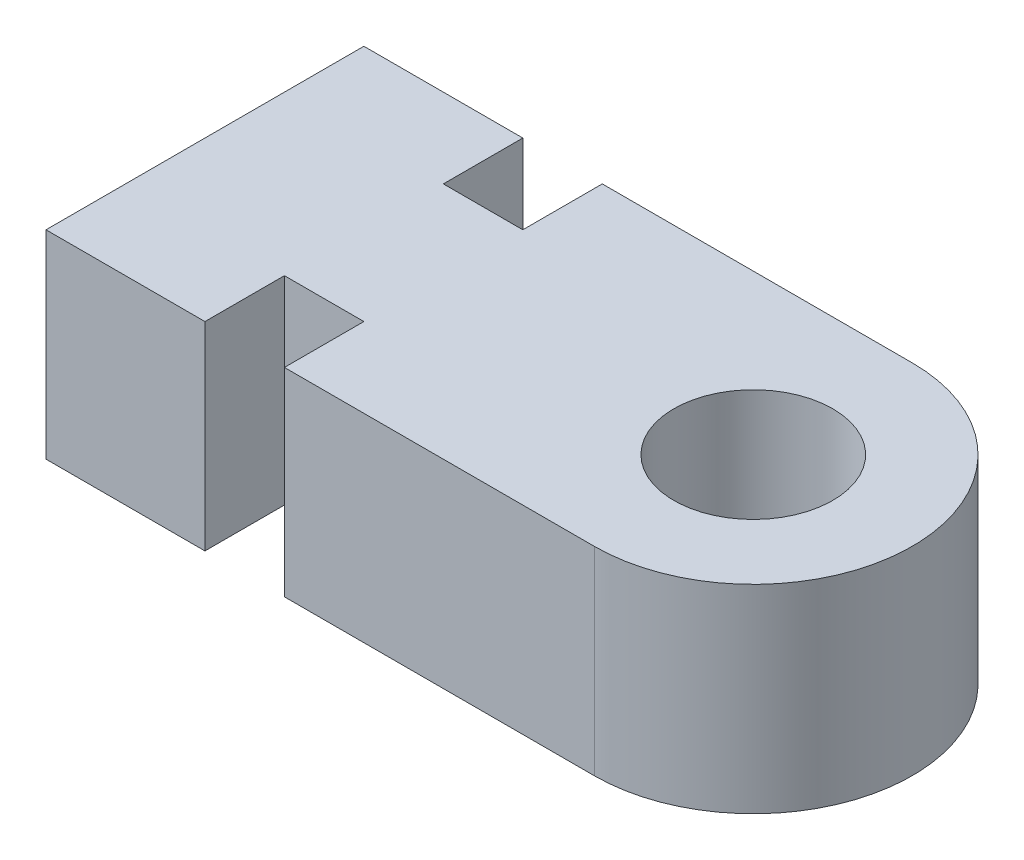
ISO-10303-21;
HEADER;
FILE_DESCRIPTION(('STEP AP214'),'2;1');
FILE_NAME('part.step','',(''),(''),'','','');
FILE_SCHEMA(('AUTOMOTIVE_DESIGN { 1 0 10303 214 1 1 1 1 }'));
ENDSEC;
DATA;
#1=APPLICATION_CONTEXT('core data for automotive mechanical design processes');
#2=APPLICATION_PROTOCOL_DEFINITION('international standard','automotive_design',2000,#1);
#3=PRODUCT_CONTEXT('',#1,'mechanical');
#4=PRODUCT('Part','Part','',(#3));
#5=PRODUCT_RELATED_PRODUCT_CATEGORY('part','',(#4));
#6=PRODUCT_DEFINITION_FORMATION('','',#4);
#7=PRODUCT_DEFINITION_CONTEXT('part definition',#1,'design');
#8=PRODUCT_DEFINITION('design','',#6,#7);
#9=PRODUCT_DEFINITION_SHAPE('','',#8);
#10=(LENGTH_UNIT() NAMED_UNIT(*) SI_UNIT(.MILLI.,.METRE.));
#11=(NAMED_UNIT(*) PLANE_ANGLE_UNIT() SI_UNIT($,.RADIAN.));
#12=(NAMED_UNIT(*) SI_UNIT($,.STERADIAN.) SOLID_ANGLE_UNIT());
#13=UNCERTAINTY_MEASURE_WITH_UNIT(LENGTH_MEASURE(1.E-05),#10,'distance_accuracy_value','');
#14=(GEOMETRIC_REPRESENTATION_CONTEXT(3) GLOBAL_UNCERTAINTY_ASSIGNED_CONTEXT((#13)) GLOBAL_UNIT_ASSIGNED_CONTEXT((#10,
#11,#12)) REPRESENTATION_CONTEXT('',''));
#15=CARTESIAN_POINT('',(0.,0.,0.));
#16=DIRECTION('',(0.,0.,1.));
#17=DIRECTION('',(1.,0.,0.));
#18=AXIS2_PLACEMENT_3D('',#15,#16,#17);
#19=CARTESIAN_POINT('',(1752.6,635.,0.));
#20=DIRECTION('',(0.,-1.,0.));
#21=DIRECTION('',(0.,0.,-1.));
#22=AXIS2_PLACEMENT_3D('',#19,#20,#21);
#23=PLANE('',#22);
#24=DIRECTION('',(1.,0.,0.));
#25=VECTOR('',#24,1.);
#26=CARTESIAN_POINT('',(0.,635.,508.));
#27=LINE('',#26,#25);
#28=CARTESIAN_POINT('',(0.,635.,508.));
#29=VERTEX_POINT('',#28);
#30=CARTESIAN_POINT('',(508.,635.,508.));
#31=VERTEX_POINT('',#30);
#32=EDGE_CURVE('E177',#29,#31,#27,.T.);
#33=ORIENTED_EDGE('',*,*,#32,.T.);
#34=DIRECTION('',(0.,0.,-1.));
#35=VECTOR('',#34,1.);
#36=CARTESIAN_POINT('',(508.,635.,508.));
#37=LINE('',#36,#35);
#38=CARTESIAN_POINT('',(508.,635.,254.));
#39=VERTEX_POINT('',#38);
#40=EDGE_CURVE('E105',#31,#39,#37,.T.);
#41=ORIENTED_EDGE('',*,*,#40,.T.);
#42=DIRECTION('',(1.,0.,0.));
#43=VECTOR('',#42,1.);
#44=CARTESIAN_POINT('',(508.,635.,254.));
#45=LINE('',#44,#43);
#46=CARTESIAN_POINT('',(762.,635.,254.));
#47=VERTEX_POINT('',#46);
#48=EDGE_CURVE('E204',#39,#47,#45,.T.);
#49=ORIENTED_EDGE('',*,*,#48,.T.);
#50=DIRECTION('',(0.,0.,1.));
#51=VECTOR('',#50,1.);
#52=CARTESIAN_POINT('',(762.,635.,254.));
#53=LINE('',#52,#51);
#54=CARTESIAN_POINT('',(762.,635.,508.));
#55=VERTEX_POINT('',#54);
#56=EDGE_CURVE('E223',#47,#55,#53,.T.);
#57=ORIENTED_EDGE('',*,*,#56,.T.);
#58=DIRECTION('',(1.,0.,0.));
#59=VECTOR('',#58,1.);
#60=CARTESIAN_POINT('',(762.,635.,508.));
#61=LINE('',#60,#59);
#62=CARTESIAN_POINT('',(1752.6,635.,508.));
#63=VERTEX_POINT('',#62);
#64=EDGE_CURVE('E220',#55,#63,#61,.T.);
#65=ORIENTED_EDGE('',*,*,#64,.T.);
#66=CARTESIAN_POINT('',(1752.6,635.,0.));
#67=DIRECTION('',(0.,1.,0.));
#68=DIRECTION('',(0.,0.,-1.));
#69=AXIS2_PLACEMENT_3D('',#66,#67,#68);
#70=CIRCLE('',#69,508.);
#71=CARTESIAN_POINT('',(1752.6,635.,-508.));
#72=VERTEX_POINT('',#71);
#73=EDGE_CURVE('E222',#63,#72,#70,.T.);
#74=ORIENTED_EDGE('',*,*,#73,.T.);
#75=DIRECTION('',(-1.,0.,0.));
#76=VECTOR('',#75,1.);
#77=CARTESIAN_POINT('',(762.,635.,-508.));
#78=LINE('',#77,#76);
#79=CARTESIAN_POINT('',(762.,635.,-508.));
#80=VERTEX_POINT('',#79);
#81=EDGE_CURVE('E225',#72,#80,#78,.T.);
#82=ORIENTED_EDGE('',*,*,#81,.T.);
#83=DIRECTION('',(0.,0.,1.));
#84=VECTOR('',#83,1.);
#85=CARTESIAN_POINT('',(762.,635.,-254.));
#86=LINE('',#85,#84);
#87=CARTESIAN_POINT('',(762.,635.,-254.));
#88=VERTEX_POINT('',#87);
#89=EDGE_CURVE('E231',#80,#88,#86,.T.);
#90=ORIENTED_EDGE('',*,*,#89,.T.);
#91=DIRECTION('',(-1.,0.,0.));
#92=VECTOR('',#91,1.);
#93=CARTESIAN_POINT('',(508.,635.,-254.));
#94=LINE('',#93,#92);
#95=CARTESIAN_POINT('',(508.,635.,-254.));
#96=VERTEX_POINT('',#95);
#97=EDGE_CURVE('E136',#88,#96,#94,.T.);
#98=ORIENTED_EDGE('',*,*,#97,.T.);
#99=DIRECTION('',(0.,0.,-1.));
#100=VECTOR('',#99,1.);
#101=CARTESIAN_POINT('',(508.,635.,-508.));
#102=LINE('',#101,#100);
#103=CARTESIAN_POINT('',(508.,635.,-508.));
#104=VERTEX_POINT('',#103);
#105=EDGE_CURVE('E130',#96,#104,#102,.T.);
#106=ORIENTED_EDGE('',*,*,#105,.T.);
#107=DIRECTION('',(-1.,0.,0.));
#108=VECTOR('',#107,1.);
#109=CARTESIAN_POINT('',(0.,635.,-508.));
#110=LINE('',#109,#108);
#111=CARTESIAN_POINT('',(0.,635.,-508.));
#112=VERTEX_POINT('',#111);
#113=EDGE_CURVE('E134',#104,#112,#110,.T.);
#114=ORIENTED_EDGE('',*,*,#113,.T.);
#115=DIRECTION('',(0.,0.,1.));
#116=VECTOR('',#115,1.);
#117=CARTESIAN_POINT('',(0.,635.,508.));
#118=LINE('',#117,#116);
#119=EDGE_CURVE('E50',#112,#29,#118,.T.);
#120=ORIENTED_EDGE('',*,*,#119,.T.);
#121=EDGE_LOOP('',(#33,#41,#49,#57,#65,#74,#82,#90,#98,#106,#114,#120));
#122=FACE_BOUND('',#121,.T.);
#123=CARTESIAN_POINT('',(1752.6,635.,0.));
#124=DIRECTION('',(0.,1.,0.));
#125=DIRECTION('',(0.,0.,1.));
#126=AXIS2_PLACEMENT_3D('',#123,#124,#125);
#127=CIRCLE('',#126,254.);
#128=CARTESIAN_POINT('',(1752.6,635.,-254.));
#129=VERTEX_POINT('',#128);
#130=EDGE_CURVE('E158',#129,#129,#127,.T.);
#131=ORIENTED_EDGE('',*,*,#130,.F.);
#132=EDGE_LOOP('',(#131));
#133=FACE_BOUND('',#132,.T.);
#134=ADVANCED_FACE('F33',(#122,#133),#23,.F.);
#135=CARTESIAN_POINT('',(1752.6,0.,0.));
#136=DIRECTION('',(0.,-1.,0.));
#137=DIRECTION('',(0.,0.,-1.));
#138=AXIS2_PLACEMENT_3D('',#135,#136,#137);
#139=PLANE('',#138);
#140=DIRECTION('',(1.,0.,0.));
#141=VECTOR('',#140,1.);
#142=CARTESIAN_POINT('',(0.,0.,508.));
#143=LINE('',#142,#141);
#144=CARTESIAN_POINT('',(0.,0.,508.));
#145=VERTEX_POINT('',#144);
#146=CARTESIAN_POINT('',(508.,0.,508.));
#147=VERTEX_POINT('',#146);
#148=EDGE_CURVE('E154',#145,#147,#143,.T.);
#149=ORIENTED_EDGE('',*,*,#148,.F.);
#150=DIRECTION('',(0.,0.,1.));
#151=VECTOR('',#150,1.);
#152=CARTESIAN_POINT('',(0.,0.,508.));
#153=LINE('',#152,#151);
#154=CARTESIAN_POINT('',(0.,0.,-508.));
#155=VERTEX_POINT('',#154);
#156=EDGE_CURVE('E97',#155,#145,#153,.T.);
#157=ORIENTED_EDGE('',*,*,#156,.F.);
#158=DIRECTION('',(-1.,0.,0.));
#159=VECTOR('',#158,1.);
#160=CARTESIAN_POINT('',(0.,0.,-508.));
#161=LINE('',#160,#159);
#162=CARTESIAN_POINT('',(508.,0.,-508.));
#163=VERTEX_POINT('',#162);
#164=EDGE_CURVE('E91',#163,#155,#161,.T.);
#165=ORIENTED_EDGE('',*,*,#164,.F.);
#166=DIRECTION('',(0.,0.,-1.));
#167=VECTOR('',#166,1.);
#168=CARTESIAN_POINT('',(508.,0.,-508.));
#169=LINE('',#168,#167);
#170=CARTESIAN_POINT('',(508.,0.,-254.));
#171=VERTEX_POINT('',#170);
#172=EDGE_CURVE('E144',#171,#163,#169,.T.);
#173=ORIENTED_EDGE('',*,*,#172,.F.);
#174=DIRECTION('',(-1.,0.,0.));
#175=VECTOR('',#174,1.);
#176=CARTESIAN_POINT('',(508.,0.,-254.));
#177=LINE('',#176,#175);
#178=CARTESIAN_POINT('',(762.,0.,-254.));
#179=VERTEX_POINT('',#178);
#180=EDGE_CURVE('E172',#179,#171,#177,.T.);
#181=ORIENTED_EDGE('',*,*,#180,.F.);
#182=DIRECTION('',(0.,0.,1.));
#183=VECTOR('',#182,1.);
#184=CARTESIAN_POINT('',(762.,0.,-254.));
#185=LINE('',#184,#183);
#186=CARTESIAN_POINT('',(762.,0.,-508.));
#187=VERTEX_POINT('',#186);
#188=EDGE_CURVE('E170',#187,#179,#185,.T.);
#189=ORIENTED_EDGE('',*,*,#188,.F.);
#190=DIRECTION('',(-1.,0.,0.));
#191=VECTOR('',#190,1.);
#192=CARTESIAN_POINT('',(762.,0.,-508.));
#193=LINE('',#192,#191);
#194=CARTESIAN_POINT('',(1752.6,0.,-508.));
#195=VERTEX_POINT('',#194);
#196=EDGE_CURVE('E168',#195,#187,#193,.T.);
#197=ORIENTED_EDGE('',*,*,#196,.F.);
#198=CARTESIAN_POINT('',(1752.6,0.,0.));
#199=DIRECTION('',(0.,1.,0.));
#200=DIRECTION('',(0.,0.,-1.));
#201=AXIS2_PLACEMENT_3D('',#198,#199,#200);
#202=CIRCLE('',#201,508.);
#203=CARTESIAN_POINT('',(1752.6,0.,508.));
#204=VERTEX_POINT('',#203);
#205=EDGE_CURVE('E166',#204,#195,#202,.T.);
#206=ORIENTED_EDGE('',*,*,#205,.F.);
#207=DIRECTION('',(1.,0.,0.));
#208=VECTOR('',#207,1.);
#209=CARTESIAN_POINT('',(762.,0.,508.));
#210=LINE('',#209,#208);
#211=CARTESIAN_POINT('',(762.,0.,508.));
#212=VERTEX_POINT('',#211);
#213=EDGE_CURVE('E164',#212,#204,#210,.T.);
#214=ORIENTED_EDGE('',*,*,#213,.F.);
#215=DIRECTION('',(0.,0.,1.));
#216=VECTOR('',#215,1.);
#217=CARTESIAN_POINT('',(762.,0.,254.));
#218=LINE('',#217,#216);
#219=CARTESIAN_POINT('',(762.,0.,254.));
#220=VERTEX_POINT('',#219);
#221=EDGE_CURVE('E162',#220,#212,#218,.T.);
#222=ORIENTED_EDGE('',*,*,#221,.F.);
#223=DIRECTION('',(1.,0.,0.));
#224=VECTOR('',#223,1.);
#225=CARTESIAN_POINT('',(508.,0.,254.));
#226=LINE('',#225,#224);
#227=CARTESIAN_POINT('',(508.,0.,254.));
#228=VERTEX_POINT('',#227);
#229=EDGE_CURVE('E160',#228,#220,#226,.T.);
#230=ORIENTED_EDGE('',*,*,#229,.F.);
#231=DIRECTION('',(0.,0.,-1.));
#232=VECTOR('',#231,1.);
#233=CARTESIAN_POINT('',(508.,0.,508.));
#234=LINE('',#233,#232);
#235=EDGE_CURVE('E157',#147,#228,#234,.T.);
#236=ORIENTED_EDGE('',*,*,#235,.F.);
#237=EDGE_LOOP('',(#149,#157,#165,#173,#181,#189,#197,#206,#214,#222,#230,#236));
#238=FACE_BOUND('',#237,.T.);
#239=CARTESIAN_POINT('',(1752.6,0.,0.));
#240=DIRECTION('',(0.,1.,0.));
#241=DIRECTION('',(0.,0.,1.));
#242=AXIS2_PLACEMENT_3D('',#239,#240,#241);
#243=CIRCLE('',#242,254.);
#244=CARTESIAN_POINT('',(1752.6,-1.11022302462516E-13,-254.));
#245=VERTEX_POINT('',#244);
#246=EDGE_CURVE('E378',#245,#245,#243,.T.);
#247=ORIENTED_EDGE('',*,*,#246,.T.);
#248=EDGE_LOOP('',(#247));
#249=FACE_BOUND('',#248,.T.);
#250=ADVANCED_FACE('F208',(#238,#249),#139,.T.);
#251=CARTESIAN_POINT('',(0.,635.,508.));
#252=DIRECTION('',(0.,0.,-1.));
#253=DIRECTION('',(-1.,0.,0.));
#254=AXIS2_PLACEMENT_3D('',#251,#252,#253);
#255=PLANE('',#254);
#256=ORIENTED_EDGE('',*,*,#148,.T.);
#257=DIRECTION('',(0.,-1.,0.));
#258=VECTOR('',#257,1.);
#259=CARTESIAN_POINT('',(508.,635.,508.));
#260=LINE('',#259,#258);
#261=EDGE_CURVE('E11',#31,#147,#260,.T.);
#262=ORIENTED_EDGE('',*,*,#261,.F.);
#263=ORIENTED_EDGE('',*,*,#32,.F.);
#264=DIRECTION('',(0.,-1.,0.));
#265=VECTOR('',#264,1.);
#266=CARTESIAN_POINT('',(0.,635.,508.));
#267=LINE('',#266,#265);
#268=EDGE_CURVE('E150',#29,#145,#267,.T.);
#269=ORIENTED_EDGE('',*,*,#268,.T.);
#270=EDGE_LOOP('',(#256,#262,#263,#269));
#271=FACE_BOUND('',#270,.T.);
#272=ADVANCED_FACE('F35',(#271),#255,.F.);
#273=CARTESIAN_POINT('',(508.,635.,508.));
#274=DIRECTION('',(-1.,0.,0.));
#275=DIRECTION('',(0.,0.,1.));
#276=AXIS2_PLACEMENT_3D('',#273,#274,#275);
#277=PLANE('',#276);
#278=ORIENTED_EDGE('',*,*,#235,.T.);
#279=DIRECTION('',(0.,-1.,0.));
#280=VECTOR('',#279,1.);
#281=CARTESIAN_POINT('',(508.,635.,254.));
#282=LINE('',#281,#280);
#283=EDGE_CURVE('E42',#39,#228,#282,.T.);
#284=ORIENTED_EDGE('',*,*,#283,.F.);
#285=ORIENTED_EDGE('',*,*,#40,.F.);
#286=ORIENTED_EDGE('',*,*,#261,.T.);
#287=EDGE_LOOP('',(#278,#284,#285,#286));
#288=FACE_BOUND('',#287,.T.);
#289=ADVANCED_FACE('F265',(#288),#277,.F.);
#290=CARTESIAN_POINT('',(508.,635.,254.));
#291=DIRECTION('',(0.,0.,-1.));
#292=DIRECTION('',(-1.,0.,0.));
#293=AXIS2_PLACEMENT_3D('',#290,#291,#292);
#294=PLANE('',#293);
#295=ORIENTED_EDGE('',*,*,#229,.T.);
#296=DIRECTION('',(0.,-1.,0.));
#297=VECTOR('',#296,1.);
#298=CARTESIAN_POINT('',(762.,635.,254.));
#299=LINE('',#298,#297);
#300=EDGE_CURVE('E196',#47,#220,#299,.T.);
#301=ORIENTED_EDGE('',*,*,#300,.F.);
#302=ORIENTED_EDGE('',*,*,#48,.F.);
#303=ORIENTED_EDGE('',*,*,#283,.T.);
#304=EDGE_LOOP('',(#295,#301,#302,#303));
#305=FACE_BOUND('',#304,.T.);
#306=ADVANCED_FACE('F202',(#305),#294,.F.);
#307=CARTESIAN_POINT('',(762.,635.,254.));
#308=DIRECTION('',(1.,0.,0.));
#309=DIRECTION('',(0.,0.,-1.));
#310=AXIS2_PLACEMENT_3D('',#307,#308,#309);
#311=PLANE('',#310);
#312=ORIENTED_EDGE('',*,*,#221,.T.);
#313=DIRECTION('',(0.,-1.,0.));
#314=VECTOR('',#313,1.);
#315=CARTESIAN_POINT('',(762.,635.,508.));
#316=LINE('',#315,#314);
#317=EDGE_CURVE('E193',#55,#212,#316,.T.);
#318=ORIENTED_EDGE('',*,*,#317,.F.);
#319=ORIENTED_EDGE('',*,*,#56,.F.);
#320=ORIENTED_EDGE('',*,*,#300,.T.);
#321=EDGE_LOOP('',(#312,#318,#319,#320));
#322=FACE_BOUND('',#321,.T.);
#323=ADVANCED_FACE('F214',(#322),#311,.F.);
#324=CARTESIAN_POINT('',(762.,635.,508.));
#325=DIRECTION('',(0.,0.,-1.));
#326=DIRECTION('',(-1.,0.,0.));
#327=AXIS2_PLACEMENT_3D('',#324,#325,#326);
#328=PLANE('',#327);
#329=ORIENTED_EDGE('',*,*,#213,.T.);
#330=DIRECTION('',(0.,-1.,0.));
#331=VECTOR('',#330,1.);
#332=CARTESIAN_POINT('',(1752.6,635.,508.));
#333=LINE('',#332,#331);
#334=EDGE_CURVE('E190',#63,#204,#333,.T.);
#335=ORIENTED_EDGE('',*,*,#334,.F.);
#336=ORIENTED_EDGE('',*,*,#64,.F.);
#337=ORIENTED_EDGE('',*,*,#317,.T.);
#338=EDGE_LOOP('',(#329,#335,#336,#337));
#339=FACE_BOUND('',#338,.T.);
#340=ADVANCED_FACE('F218',(#339),#328,.F.);
#341=CARTESIAN_POINT('',(1752.6,635.,0.));
#342=DIRECTION('',(0.,-1.,0.));
#343=DIRECTION('',(0.,0.,-1.));
#344=AXIS2_PLACEMENT_3D('',#341,#342,#343);
#345=CYLINDRICAL_SURFACE('',#344,508.);
#346=ORIENTED_EDGE('',*,*,#205,.T.);
#347=DIRECTION('',(0.,-1.,0.));
#348=VECTOR('',#347,1.);
#349=CARTESIAN_POINT('',(1752.6,635.,-508.));
#350=LINE('',#349,#348);
#351=EDGE_CURVE('E187',#72,#195,#350,.T.);
#352=ORIENTED_EDGE('',*,*,#351,.F.);
#353=ORIENTED_EDGE('',*,*,#73,.F.);
#354=ORIENTED_EDGE('',*,*,#334,.T.);
#355=EDGE_LOOP('',(#346,#352,#353,#354));
#356=FACE_BOUND('',#355,.T.);
#357=ADVANCED_FACE('F278',(#356),#345,.T.);
#358=CARTESIAN_POINT('',(762.,635.,-508.));
#359=DIRECTION('',(0.,0.,1.));
#360=DIRECTION('',(1.,0.,0.));
#361=AXIS2_PLACEMENT_3D('',#358,#359,#360);
#362=PLANE('',#361);
#363=ORIENTED_EDGE('',*,*,#196,.T.);
#364=DIRECTION('',(0.,-1.,0.));
#365=VECTOR('',#364,1.);
#366=CARTESIAN_POINT('',(762.,635.,-508.));
#367=LINE('',#366,#365);
#368=EDGE_CURVE('E184',#80,#187,#367,.T.);
#369=ORIENTED_EDGE('',*,*,#368,.F.);
#370=ORIENTED_EDGE('',*,*,#81,.F.);
#371=ORIENTED_EDGE('',*,*,#351,.T.);
#372=EDGE_LOOP('',(#363,#369,#370,#371));
#373=FACE_BOUND('',#372,.T.);
#374=ADVANCED_FACE('F281',(#373),#362,.F.);
#375=CARTESIAN_POINT('',(762.,635.,-254.));
#376=DIRECTION('',(1.,0.,0.));
#377=DIRECTION('',(0.,0.,-1.));
#378=AXIS2_PLACEMENT_3D('',#375,#376,#377);
#379=PLANE('',#378);
#380=ORIENTED_EDGE('',*,*,#188,.T.);
#381=DIRECTION('',(0.,-1.,0.));
#382=VECTOR('',#381,1.);
#383=CARTESIAN_POINT('',(762.,635.,-254.));
#384=LINE('',#383,#382);
#385=EDGE_CURVE('E181',#88,#179,#384,.T.);
#386=ORIENTED_EDGE('',*,*,#385,.F.);
#387=ORIENTED_EDGE('',*,*,#89,.F.);
#388=ORIENTED_EDGE('',*,*,#368,.T.);
#389=EDGE_LOOP('',(#380,#386,#387,#388));
#390=FACE_BOUND('',#389,.T.);
#391=ADVANCED_FACE('F237',(#390),#379,.F.);
#392=CARTESIAN_POINT('',(508.,635.,-254.));
#393=DIRECTION('',(0.,0.,1.));
#394=DIRECTION('',(1.,0.,0.));
#395=AXIS2_PLACEMENT_3D('',#392,#393,#394);
#396=PLANE('',#395);
#397=ORIENTED_EDGE('',*,*,#180,.T.);
#398=DIRECTION('',(0.,-1.,0.));
#399=VECTOR('',#398,1.);
#400=CARTESIAN_POINT('',(508.,635.,-254.));
#401=LINE('',#400,#399);
#402=EDGE_CURVE('E145',#96,#171,#401,.T.);
#403=ORIENTED_EDGE('',*,*,#402,.F.);
#404=ORIENTED_EDGE('',*,*,#97,.F.);
#405=ORIENTED_EDGE('',*,*,#385,.T.);
#406=EDGE_LOOP('',(#397,#403,#404,#405));
#407=FACE_BOUND('',#406,.T.);
#408=ADVANCED_FACE('F241',(#407),#396,.F.);
#409=CARTESIAN_POINT('',(508.,635.,-508.));
#410=DIRECTION('',(-1.,0.,0.));
#411=DIRECTION('',(0.,0.,1.));
#412=AXIS2_PLACEMENT_3D('',#409,#410,#411);
#413=PLANE('',#412);
#414=ORIENTED_EDGE('',*,*,#172,.T.);
#415=DIRECTION('',(0.,-1.,0.));
#416=VECTOR('',#415,1.);
#417=CARTESIAN_POINT('',(508.,635.,-508.));
#418=LINE('',#417,#416);
#419=EDGE_CURVE('E141',#104,#163,#418,.T.);
#420=ORIENTED_EDGE('',*,*,#419,.F.);
#421=ORIENTED_EDGE('',*,*,#105,.F.);
#422=ORIENTED_EDGE('',*,*,#402,.T.);
#423=EDGE_LOOP('',(#414,#420,#421,#422));
#424=FACE_BOUND('',#423,.T.);
#425=ADVANCED_FACE('F142',(#424),#413,.F.);
#426=CARTESIAN_POINT('',(0.,635.,-508.));
#427=DIRECTION('',(0.,0.,1.));
#428=DIRECTION('',(1.,0.,0.));
#429=AXIS2_PLACEMENT_3D('',#426,#427,#428);
#430=PLANE('',#429);
#431=ORIENTED_EDGE('',*,*,#164,.T.);
#432=DIRECTION('',(0.,-1.,0.));
#433=VECTOR('',#432,1.);
#434=CARTESIAN_POINT('',(0.,635.,-508.));
#435=LINE('',#434,#433);
#436=EDGE_CURVE('E146',#112,#155,#435,.T.);
#437=ORIENTED_EDGE('',*,*,#436,.F.);
#438=ORIENTED_EDGE('',*,*,#113,.F.);
#439=ORIENTED_EDGE('',*,*,#419,.T.);
#440=EDGE_LOOP('',(#431,#437,#438,#439));
#441=FACE_BOUND('',#440,.T.);
#442=ADVANCED_FACE('F148',(#441),#430,.F.);
#443=CARTESIAN_POINT('',(0.,635.,508.));
#444=DIRECTION('',(1.,0.,0.));
#445=DIRECTION('',(0.,0.,-1.));
#446=AXIS2_PLACEMENT_3D('',#443,#444,#445);
#447=PLANE('',#446);
#448=ORIENTED_EDGE('',*,*,#156,.T.);
#449=ORIENTED_EDGE('',*,*,#268,.F.);
#450=ORIENTED_EDGE('',*,*,#119,.F.);
#451=ORIENTED_EDGE('',*,*,#436,.T.);
#452=EDGE_LOOP('',(#448,#449,#450,#451));
#453=FACE_BOUND('',#452,.T.);
#454=ADVANCED_FACE('F245',(#453),#447,.F.);
#455=CARTESIAN_POINT('',(1752.6,635.,0.));
#456=DIRECTION('',(0.,-1.,0.));
#457=DIRECTION('',(0.,0.,-1.));
#458=AXIS2_PLACEMENT_3D('',#455,#456,#457);
#459=CYLINDRICAL_SURFACE('',#458,254.);
#460=CARTESIAN_POINT('',(1752.6,635.,-254.));
#461=CARTESIAN_POINT('',(1752.6,628.385416666667,-254.));
#462=CARTESIAN_POINT('',(1752.6,621.770833333333,-254.));
#463=CARTESIAN_POINT('',(1752.6,608.541666666667,-254.));
#464=CARTESIAN_POINT('',(1752.6,601.927083333333,-254.));
#465=CARTESIAN_POINT('',(1752.6,588.697916666667,-254.));
#466=CARTESIAN_POINT('',(1752.6,582.083333333333,-254.));
#467=CARTESIAN_POINT('',(1752.6,568.854166666667,-254.));
#468=CARTESIAN_POINT('',(1752.6,562.239583333333,-254.));
#469=CARTESIAN_POINT('',(1752.6,549.010416666667,-254.));
#470=CARTESIAN_POINT('',(1752.6,542.395833333333,-254.));
#471=CARTESIAN_POINT('',(1752.6,529.166666666667,-254.));
#472=CARTESIAN_POINT('',(1752.6,522.552083333333,-254.));
#473=CARTESIAN_POINT('',(1752.6,509.322916666667,-254.));
#474=CARTESIAN_POINT('',(1752.6,502.708333333333,-254.));
#475=CARTESIAN_POINT('',(1752.6,489.479166666667,-254.));
#476=CARTESIAN_POINT('',(1752.6,482.864583333333,-254.));
#477=CARTESIAN_POINT('',(1752.6,469.635416666667,-254.));
#478=CARTESIAN_POINT('',(1752.6,463.020833333333,-254.));
#479=CARTESIAN_POINT('',(1752.6,449.791666666667,-254.));
#480=CARTESIAN_POINT('',(1752.6,443.177083333333,-254.));
#481=CARTESIAN_POINT('',(1752.6,429.947916666667,-254.));
#482=CARTESIAN_POINT('',(1752.6,423.333333333333,-254.));
#483=CARTESIAN_POINT('',(1752.6,410.104166666667,-254.));
#484=CARTESIAN_POINT('',(1752.6,403.489583333333,-254.));
#485=CARTESIAN_POINT('',(1752.6,390.260416666667,-254.));
#486=CARTESIAN_POINT('',(1752.6,383.645833333333,-254.));
#487=CARTESIAN_POINT('',(1752.6,370.416666666667,-254.));
#488=CARTESIAN_POINT('',(1752.6,363.802083333333,-254.));
#489=CARTESIAN_POINT('',(1752.6,350.572916666667,-254.));
#490=CARTESIAN_POINT('',(1752.6,343.958333333333,-254.));
#491=CARTESIAN_POINT('',(1752.6,330.729166666667,-254.));
#492=CARTESIAN_POINT('',(1752.6,324.114583333333,-254.));
#493=CARTESIAN_POINT('',(1752.6,310.885416666667,-254.));
#494=CARTESIAN_POINT('',(1752.6,304.270833333333,-254.));
#495=CARTESIAN_POINT('',(1752.6,291.041666666667,-254.));
#496=CARTESIAN_POINT('',(1752.6,284.427083333333,-254.));
#497=CARTESIAN_POINT('',(1752.6,271.197916666667,-254.));
#498=CARTESIAN_POINT('',(1752.6,264.583333333333,-254.));
#499=CARTESIAN_POINT('',(1752.6,251.354166666667,-254.));
#500=CARTESIAN_POINT('',(1752.6,244.739583333333,-254.));
#501=CARTESIAN_POINT('',(1752.6,231.510416666667,-254.));
#502=CARTESIAN_POINT('',(1752.6,224.895833333333,-254.));
#503=CARTESIAN_POINT('',(1752.6,211.666666666667,-254.));
#504=CARTESIAN_POINT('',(1752.6,205.052083333333,-254.));
#505=CARTESIAN_POINT('',(1752.6,191.822916666666,-254.));
#506=CARTESIAN_POINT('',(1752.6,185.208333333333,-254.));
#507=CARTESIAN_POINT('',(1752.6,171.979166666666,-254.));
#508=CARTESIAN_POINT('',(1752.6,165.364583333333,-254.));
#509=CARTESIAN_POINT('',(1752.6,152.135416666666,-254.));
#510=CARTESIAN_POINT('',(1752.6,145.520833333333,-254.));
#511=CARTESIAN_POINT('',(1752.6,132.291666666667,-254.));
#512=CARTESIAN_POINT('',(1752.6,125.677083333333,-254.));
#513=CARTESIAN_POINT('',(1752.6,112.447916666667,-254.));
#514=CARTESIAN_POINT('',(1752.6,105.833333333333,-254.));
#515=CARTESIAN_POINT('',(1752.6,92.6041666666666,-254.));
#516=CARTESIAN_POINT('',(1752.6,85.9895833333332,-254.));
#517=CARTESIAN_POINT('',(1752.6,72.7604166666665,-254.));
#518=CARTESIAN_POINT('',(1752.6,66.1458333333332,-254.));
#519=CARTESIAN_POINT('',(1752.6,52.9166666666666,-254.));
#520=CARTESIAN_POINT('',(1752.6,46.3020833333332,-254.));
#521=CARTESIAN_POINT('',(1752.6,33.0729166666666,-254.));
#522=CARTESIAN_POINT('',(1752.6,26.4583333333333,-254.));
#523=CARTESIAN_POINT('',(1752.6,13.2291666666666,-254.));
#524=CARTESIAN_POINT('',(1752.6,6.61458333333324,-254.));
#525=CARTESIAN_POINT('',(1752.6,-1.11022302462516E-13,-254.));
#526=B_SPLINE_CURVE_WITH_KNOTS('',3,(#460,#461,#462,#463,#464,#465,#466,#467,#468,#469,#470,
#471,#472,#473,#474,#475,#476,#477,#478,#479,#480,#481,#482,#483,#484,#485,#486,#487,#488,#489,
#490,#491,#492,#493,#494,#495,#496,#497,#498,#499,#500,#501,#502,#503,#504,#505,#506,#507,#508,
#509,#510,#511,#512,#513,#514,#515,#516,#517,#518,#519,#520,#521,#522,#523,#524,#525),
.UNSPECIFIED.,.F.,.F.,(4,2,2,2,2,2,2,2,2,2,2,2,2,2,2,2,2,2,2,2,2,2,2,2,2,2,2,2,2,2,2,2,4),(0.,
19.84375,39.6875000000001,59.53125,79.3750000000001,99.2187500000001,119.0625,138.90625,158.75,
178.59375,198.4375,218.28125,238.125,257.96875,277.8125,297.65625,317.5,337.34375,357.1875,
377.03125,396.875,416.71875,436.5625,456.40625,476.25,496.09375,515.9375,535.78125,555.625,
575.46875,595.3125,615.15625,635.),.UNSPECIFIED.);
#527=EDGE_CURVE('BSEAM247',#129,#245,#526,.T.);
#528=ORIENTED_EDGE('',*,*,#130,.T.);
#529=ORIENTED_EDGE('',*,*,#246,.F.);
#530=ORIENTED_EDGE('',*,*,#527,.T.);
#531=ORIENTED_EDGE('',*,*,#527,.F.);
#532=EDGE_LOOP('',(#528,#530,#529,#531));
#533=FACE_BOUND('',#532,.T.);
#534=ADVANCED_FACE('F247',(#533),#459,.F.);
#535=CLOSED_SHELL('',(#134,#250,#272,#289,#306,#323,#340,#357,#374,#391,#408,#425,#442,#454,#534));
#536=MANIFOLD_SOLID_BREP('B2',#535);
#537=ADVANCED_BREP_SHAPE_REPRESENTATION('',(#18,#536),#14);
#538=SHAPE_DEFINITION_REPRESENTATION(#9,#537);
ENDSEC;
END-ISO-10303-21;
